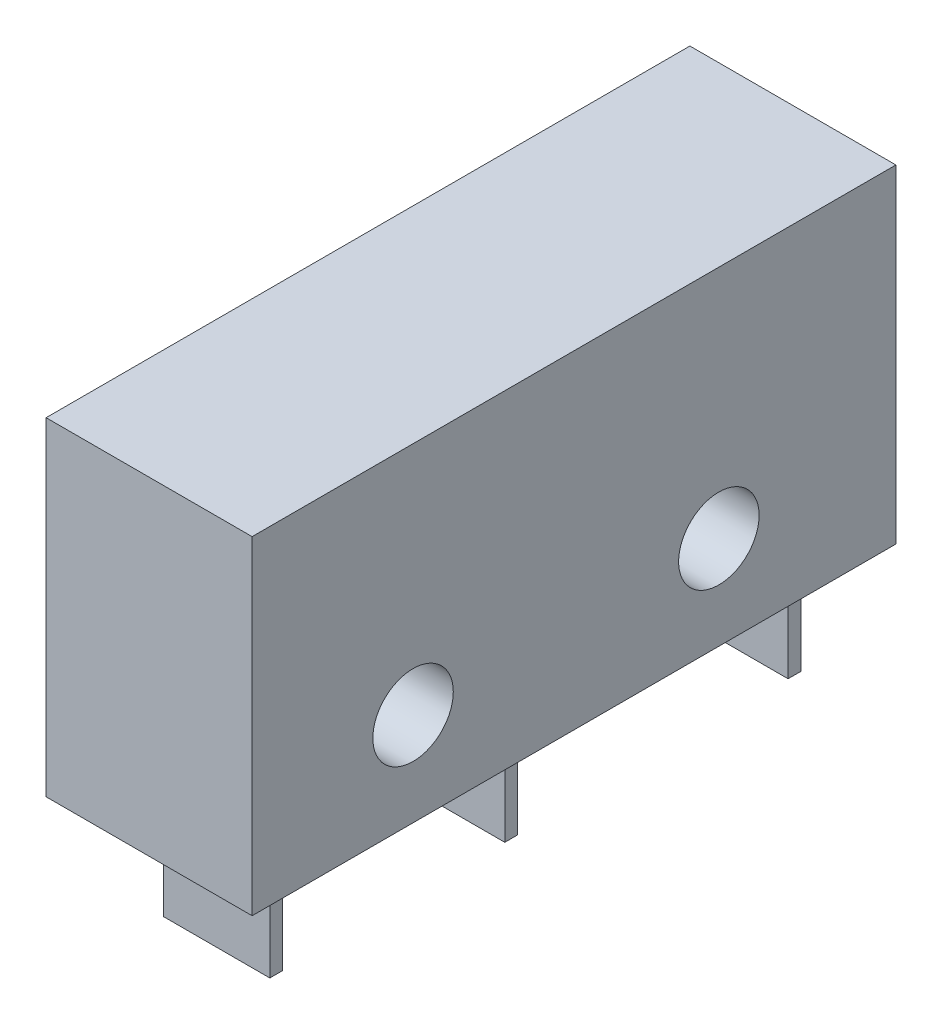
ISO-10303-21;
HEADER;
FILE_DESCRIPTION(('STEP AP214'),'2;1');
FILE_NAME('part.step','',(''),(''),'','','');
FILE_SCHEMA(('AUTOMOTIVE_DESIGN { 1 0 10303 214 1 1 1 1 }'));
ENDSEC;
DATA;
#1=APPLICATION_CONTEXT('core data for automotive mechanical design processes');
#2=APPLICATION_PROTOCOL_DEFINITION('international standard','automotive_design',2000,#1);
#3=PRODUCT_CONTEXT('',#1,'mechanical');
#4=PRODUCT('Part','Part','',(#3));
#5=PRODUCT_RELATED_PRODUCT_CATEGORY('part','',(#4));
#6=PRODUCT_DEFINITION_FORMATION('','',#4);
#7=PRODUCT_DEFINITION_CONTEXT('part definition',#1,'design');
#8=PRODUCT_DEFINITION('design','',#6,#7);
#9=PRODUCT_DEFINITION_SHAPE('','',#8);
#10=(LENGTH_UNIT() NAMED_UNIT(*) SI_UNIT(.MILLI.,.METRE.));
#11=(NAMED_UNIT(*) PLANE_ANGLE_UNIT() SI_UNIT($,.RADIAN.));
#12=(NAMED_UNIT(*) SI_UNIT($,.STERADIAN.) SOLID_ANGLE_UNIT());
#13=UNCERTAINTY_MEASURE_WITH_UNIT(LENGTH_MEASURE(1.E-05),#10,'distance_accuracy_value','');
#14=(GEOMETRIC_REPRESENTATION_CONTEXT(3) GLOBAL_UNCERTAINTY_ASSIGNED_CONTEXT((#13)) GLOBAL_UNIT_ASSIGNED_CONTEXT((#10,
#11,#12)) REPRESENTATION_CONTEXT('',''));
#15=CARTESIAN_POINT('',(0.,0.,0.));
#16=DIRECTION('',(0.,0.,1.));
#17=DIRECTION('',(1.,0.,0.));
#18=AXIS2_PLACEMENT_3D('',#15,#16,#17);
#19=CARTESIAN_POINT('',(3.2,-5.1,10.));
#20=DIRECTION('',(0.,1.,0.));
#21=DIRECTION('',(0.,0.,1.));
#22=AXIS2_PLACEMENT_3D('',#19,#20,#21);
#23=PLANE('',#22);
#24=DIRECTION('',(0.,0.,1.));
#25=VECTOR('',#24,1.);
#26=CARTESIAN_POINT('',(1.65,-5.1,0.199999999999999));
#27=LINE('',#26,#25);
#28=CARTESIAN_POINT('',(1.65,-5.1,0.199999999999999));
#29=VERTEX_POINT('',#28);
#30=CARTESIAN_POINT('',(1.65,-5.1,0.6));
#31=VERTEX_POINT('',#30);
#32=EDGE_CURVE('E207',#29,#31,#27,.T.);
#33=ORIENTED_EDGE('',*,*,#32,.F.);
#34=DIRECTION('',(1.,0.,0.));
#35=VECTOR('',#34,1.);
#36=CARTESIAN_POINT('',(-1.65,-5.1,0.199999999999999));
#37=LINE('',#36,#35);
#38=CARTESIAN_POINT('',(-1.65,-5.1,0.199999999999999));
#39=VERTEX_POINT('',#38);
#40=EDGE_CURVE('E197',#39,#29,#37,.T.);
#41=ORIENTED_EDGE('',*,*,#40,.F.);
#42=DIRECTION('',(0.,0.,-1.));
#43=VECTOR('',#42,1.);
#44=CARTESIAN_POINT('',(-1.65,-5.1,0.199999999999999));
#45=LINE('',#44,#43);
#46=CARTESIAN_POINT('',(-1.65,-5.1,0.6));
#47=VERTEX_POINT('',#46);
#48=EDGE_CURVE('E200',#47,#39,#45,.T.);
#49=ORIENTED_EDGE('',*,*,#48,.F.);
#50=DIRECTION('',(-1.,0.,0.));
#51=VECTOR('',#50,1.);
#52=CARTESIAN_POINT('',(-1.65,-5.1,0.599999999999999));
#53=LINE('',#52,#51);
#54=EDGE_CURVE('E204',#31,#47,#53,.T.);
#55=ORIENTED_EDGE('',*,*,#54,.F.);
#56=EDGE_LOOP('',(#33,#41,#49,#55));
#57=FACE_BOUND('',#56,.T.);
#58=DIRECTION('',(0.,0.,-1.));
#59=VECTOR('',#58,1.);
#60=CARTESIAN_POINT('',(-3.2,-5.1,10.));
#61=LINE('',#60,#59);
#62=CARTESIAN_POINT('',(-3.2,-5.1,10.));
#63=VERTEX_POINT('',#62);
#64=CARTESIAN_POINT('',(-3.2,-5.1,-10.));
#65=VERTEX_POINT('',#64);
#66=EDGE_CURVE('E267',#63,#65,#61,.T.);
#67=ORIENTED_EDGE('',*,*,#66,.T.);
#68=DIRECTION('',(-1.,0.,0.));
#69=VECTOR('',#68,1.);
#70=CARTESIAN_POINT('',(3.2,-5.1,-10.));
#71=LINE('',#70,#69);
#72=CARTESIAN_POINT('',(3.2,-5.1,-10.));
#73=VERTEX_POINT('',#72);
#74=EDGE_CURVE('E273',#73,#65,#71,.T.);
#75=ORIENTED_EDGE('',*,*,#74,.F.);
#76=DIRECTION('',(0.,0.,-1.));
#77=VECTOR('',#76,1.);
#78=CARTESIAN_POINT('',(3.2,-5.1,10.));
#79=LINE('',#78,#77);
#80=CARTESIAN_POINT('',(3.2,-5.1,10.));
#81=VERTEX_POINT('',#80);
#82=EDGE_CURVE('E271',#81,#73,#79,.T.);
#83=ORIENTED_EDGE('',*,*,#82,.F.);
#84=DIRECTION('',(-1.,0.,0.));
#85=VECTOR('',#84,1.);
#86=CARTESIAN_POINT('',(3.2,-5.1,10.));
#87=LINE('',#86,#85);
#88=EDGE_CURVE('E283',#81,#63,#87,.T.);
#89=ORIENTED_EDGE('',*,*,#88,.T.);
#90=EDGE_LOOP('',(#67,#75,#83,#89));
#91=FACE_BOUND('',#90,.T.);
#92=DIRECTION('',(0.,0.,1.));
#93=VECTOR('',#92,1.);
#94=CARTESIAN_POINT('',(1.65,-5.1,-8.6));
#95=LINE('',#94,#93);
#96=CARTESIAN_POINT('',(1.65,-5.1,-8.6));
#97=VERTEX_POINT('',#96);
#98=CARTESIAN_POINT('',(1.65,-5.1,-8.2));
#99=VERTEX_POINT('',#98);
#100=EDGE_CURVE('E210',#97,#99,#95,.T.);
#101=ORIENTED_EDGE('',*,*,#100,.F.);
#102=DIRECTION('',(1.,0.,0.));
#103=VECTOR('',#102,1.);
#104=CARTESIAN_POINT('',(-1.65,-5.1,-8.6));
#105=LINE('',#104,#103);
#106=CARTESIAN_POINT('',(-1.65,-5.1,-8.6));
#107=VERTEX_POINT('',#106);
#108=EDGE_CURVE('E222',#107,#97,#105,.T.);
#109=ORIENTED_EDGE('',*,*,#108,.F.);
#110=DIRECTION('',(0.,0.,-1.));
#111=VECTOR('',#110,1.);
#112=CARTESIAN_POINT('',(-1.65,-5.1,-8.6));
#113=LINE('',#112,#111);
#114=CARTESIAN_POINT('',(-1.65,-5.1,-8.2));
#115=VERTEX_POINT('',#114);
#116=EDGE_CURVE('E234',#115,#107,#113,.T.);
#117=ORIENTED_EDGE('',*,*,#116,.F.);
#118=DIRECTION('',(-1.,0.,0.));
#119=VECTOR('',#118,1.);
#120=CARTESIAN_POINT('',(-1.65,-5.1,-8.2));
#121=LINE('',#120,#119);
#122=EDGE_CURVE('E231',#99,#115,#121,.T.);
#123=ORIENTED_EDGE('',*,*,#122,.F.);
#124=EDGE_LOOP('',(#101,#109,#117,#123));
#125=FACE_BOUND('',#124,.T.);
#126=DIRECTION('',(0.,0.,1.));
#127=VECTOR('',#126,1.);
#128=CARTESIAN_POINT('',(1.65,-5.1,7.5));
#129=LINE('',#128,#127);
#130=CARTESIAN_POINT('',(1.65,-5.1,7.5));
#131=VERTEX_POINT('',#130);
#132=CARTESIAN_POINT('',(1.65,-5.1,7.9));
#133=VERTEX_POINT('',#132);
#134=EDGE_CURVE('E150',#131,#133,#129,.T.);
#135=ORIENTED_EDGE('',*,*,#134,.F.);
#136=DIRECTION('',(1.,0.,0.));
#137=VECTOR('',#136,1.);
#138=CARTESIAN_POINT('',(-1.65,-5.1,7.5));
#139=LINE('',#138,#137);
#140=CARTESIAN_POINT('',(-1.65,-5.1,7.5));
#141=VERTEX_POINT('',#140);
#142=EDGE_CURVE('E152',#141,#131,#139,.T.);
#143=ORIENTED_EDGE('',*,*,#142,.F.);
#144=DIRECTION('',(0.,0.,-1.));
#145=VECTOR('',#144,1.);
#146=CARTESIAN_POINT('',(-1.65,-5.1,7.5));
#147=LINE('',#146,#145);
#148=CARTESIAN_POINT('',(-1.65,-5.1,7.9));
#149=VERTEX_POINT('',#148);
#150=EDGE_CURVE('E61',#149,#141,#147,.T.);
#151=ORIENTED_EDGE('',*,*,#150,.F.);
#152=DIRECTION('',(-1.,0.,0.));
#153=VECTOR('',#152,1.);
#154=CARTESIAN_POINT('',(-1.65,-5.1,7.9));
#155=LINE('',#154,#153);
#156=EDGE_CURVE('E56',#133,#149,#155,.T.);
#157=ORIENTED_EDGE('',*,*,#156,.F.);
#158=EDGE_LOOP('',(#135,#143,#151,#157));
#159=FACE_BOUND('',#158,.T.);
#160=ADVANCED_FACE('F41',(#57,#91,#125,#159),#23,.F.);
#161=CARTESIAN_POINT('',(3.2,-5.1,-10.));
#162=DIRECTION('',(0.,0.,1.));
#163=DIRECTION('',(1.,0.,0.));
#164=AXIS2_PLACEMENT_3D('',#161,#162,#163);
#165=PLANE('',#164);
#166=DIRECTION('',(0.,1.,0.));
#167=VECTOR('',#166,1.);
#168=CARTESIAN_POINT('',(-3.2,-5.1,-10.));
#169=LINE('',#168,#167);
#170=CARTESIAN_POINT('',(-3.2,5.1,-10.));
#171=VERTEX_POINT('',#170);
#172=EDGE_CURVE('E258',#65,#171,#169,.T.);
#173=ORIENTED_EDGE('',*,*,#172,.T.);
#174=DIRECTION('',(-1.,0.,0.));
#175=VECTOR('',#174,1.);
#176=CARTESIAN_POINT('',(3.2,5.1,-10.));
#177=LINE('',#176,#175);
#178=CARTESIAN_POINT('',(3.2,5.1,-10.));
#179=VERTEX_POINT('',#178);
#180=EDGE_CURVE('E11',#179,#171,#177,.T.);
#181=ORIENTED_EDGE('',*,*,#180,.F.);
#182=DIRECTION('',(0.,1.,0.));
#183=VECTOR('',#182,1.);
#184=CARTESIAN_POINT('',(3.2,-5.1,-10.));
#185=LINE('',#184,#183);
#186=EDGE_CURVE('E263',#73,#179,#185,.T.);
#187=ORIENTED_EDGE('',*,*,#186,.F.);
#188=ORIENTED_EDGE('',*,*,#74,.T.);
#189=EDGE_LOOP('',(#173,#181,#187,#188));
#190=FACE_BOUND('',#189,.T.);
#191=ADVANCED_FACE('F43',(#190),#165,.F.);
#192=CARTESIAN_POINT('',(3.2,5.1,10.));
#193=DIRECTION('',(0.,-1.,0.));
#194=DIRECTION('',(0.,0.,-1.));
#195=AXIS2_PLACEMENT_3D('',#192,#193,#194);
#196=PLANE('',#195);
#197=DIRECTION('',(0.,0.,1.));
#198=VECTOR('',#197,1.);
#199=CARTESIAN_POINT('',(-3.2,5.1,10.));
#200=LINE('',#199,#198);
#201=CARTESIAN_POINT('',(-3.2,5.1,10.));
#202=VERTEX_POINT('',#201);
#203=EDGE_CURVE('E276',#171,#202,#200,.T.);
#204=ORIENTED_EDGE('',*,*,#203,.T.);
#205=DIRECTION('',(-1.,0.,0.));
#206=VECTOR('',#205,1.);
#207=CARTESIAN_POINT('',(3.2,5.1,10.));
#208=LINE('',#207,#206);
#209=CARTESIAN_POINT('',(3.2,5.1,10.));
#210=VERTEX_POINT('',#209);
#211=EDGE_CURVE('E49',#210,#202,#208,.T.);
#212=ORIENTED_EDGE('',*,*,#211,.F.);
#213=DIRECTION('',(0.,0.,1.));
#214=VECTOR('',#213,1.);
#215=CARTESIAN_POINT('',(3.2,5.1,10.));
#216=LINE('',#215,#214);
#217=EDGE_CURVE('E266',#179,#210,#216,.T.);
#218=ORIENTED_EDGE('',*,*,#217,.F.);
#219=ORIENTED_EDGE('',*,*,#180,.T.);
#220=EDGE_LOOP('',(#204,#212,#218,#219));
#221=FACE_BOUND('',#220,.T.);
#222=ADVANCED_FACE('F306',(#221),#196,.F.);
#223=CARTESIAN_POINT('',(3.2,-5.1,10.));
#224=DIRECTION('',(0.,0.,-1.));
#225=DIRECTION('',(-1.,0.,0.));
#226=AXIS2_PLACEMENT_3D('',#223,#224,#225);
#227=PLANE('',#226);
#228=DIRECTION('',(0.,-1.,0.));
#229=VECTOR('',#228,1.);
#230=CARTESIAN_POINT('',(-3.2,-5.1,10.));
#231=LINE('',#230,#229);
#232=EDGE_CURVE('E278',#202,#63,#231,.T.);
#233=ORIENTED_EDGE('',*,*,#232,.T.);
#234=ORIENTED_EDGE('',*,*,#88,.F.);
#235=DIRECTION('',(0.,-1.,0.));
#236=VECTOR('',#235,1.);
#237=CARTESIAN_POINT('',(3.2,-5.1,10.));
#238=LINE('',#237,#236);
#239=EDGE_CURVE('E269',#210,#81,#238,.T.);
#240=ORIENTED_EDGE('',*,*,#239,.F.);
#241=ORIENTED_EDGE('',*,*,#211,.T.);
#242=EDGE_LOOP('',(#233,#234,#240,#241));
#243=FACE_BOUND('',#242,.T.);
#244=ADVANCED_FACE('F290',(#243),#227,.F.);
#245=CARTESIAN_POINT('',(3.2,0.,0.));
#246=DIRECTION('',(-1.,0.,0.));
#247=DIRECTION('',(0.,0.,1.));
#248=AXIS2_PLACEMENT_3D('',#245,#246,#247);
#249=PLANE('',#248);
#250=CARTESIAN_POINT('',(3.2,-2.2,5.));
#251=DIRECTION('',(1.,0.,0.));
#252=DIRECTION('',(0.,0.,-1.));
#253=AXIS2_PLACEMENT_3D('',#250,#251,#252);
#254=CIRCLE('',#253,1.25);
#255=CARTESIAN_POINT('',(3.2,-2.2,3.75));
#256=VERTEX_POINT('',#255);
#257=EDGE_CURVE('E251',#256,#256,#254,.T.);
#258=ORIENTED_EDGE('',*,*,#257,.F.);
#259=EDGE_LOOP('',(#258));
#260=FACE_BOUND('',#259,.T.);
#261=CARTESIAN_POINT('',(3.2,-2.2,-4.5));
#262=DIRECTION('',(1.,0.,0.));
#263=DIRECTION('',(0.,0.,-1.));
#264=AXIS2_PLACEMENT_3D('',#261,#262,#263);
#265=CIRCLE('',#264,1.25);
#266=CARTESIAN_POINT('',(3.2,-2.2,-5.75));
#267=VERTEX_POINT('',#266);
#268=EDGE_CURVE('E255',#267,#267,#265,.T.);
#269=ORIENTED_EDGE('',*,*,#268,.F.);
#270=EDGE_LOOP('',(#269));
#271=FACE_BOUND('',#270,.T.);
#272=ORIENTED_EDGE('',*,*,#186,.T.);
#273=ORIENTED_EDGE('',*,*,#217,.T.);
#274=ORIENTED_EDGE('',*,*,#239,.T.);
#275=ORIENTED_EDGE('',*,*,#82,.T.);
#276=EDGE_LOOP('',(#272,#273,#274,#275));
#277=FACE_BOUND('',#276,.T.);
#278=ADVANCED_FACE('F305',(#260,#271,#277),#249,.F.);
#279=CARTESIAN_POINT('',(-3.2,0.,0.));
#280=DIRECTION('',(-1.,0.,0.));
#281=DIRECTION('',(0.,0.,1.));
#282=AXIS2_PLACEMENT_3D('',#279,#280,#281);
#283=PLANE('',#282);
#284=CARTESIAN_POINT('',(-3.2,-2.2,5.));
#285=DIRECTION('',(1.,0.,0.));
#286=DIRECTION('',(0.,0.,-1.));
#287=AXIS2_PLACEMENT_3D('',#284,#285,#286);
#288=CIRCLE('',#287,1.25);
#289=CARTESIAN_POINT('',(-3.2,-2.2,3.75));
#290=VERTEX_POINT('',#289);
#291=EDGE_CURVE('E254',#290,#290,#288,.T.);
#292=ORIENTED_EDGE('',*,*,#291,.T.);
#293=EDGE_LOOP('',(#292));
#294=FACE_BOUND('',#293,.T.);
#295=CARTESIAN_POINT('',(-3.2,-2.2,-4.5));
#296=DIRECTION('',(1.,0.,0.));
#297=DIRECTION('',(0.,0.,-1.));
#298=AXIS2_PLACEMENT_3D('',#295,#296,#297);
#299=CIRCLE('',#298,1.25);
#300=CARTESIAN_POINT('',(-3.2,-2.2,-5.75));
#301=VERTEX_POINT('',#300);
#302=EDGE_CURVE('E250',#301,#301,#299,.T.);
#303=ORIENTED_EDGE('',*,*,#302,.T.);
#304=EDGE_LOOP('',(#303));
#305=FACE_BOUND('',#304,.T.);
#306=ORIENTED_EDGE('',*,*,#172,.F.);
#307=ORIENTED_EDGE('',*,*,#66,.F.);
#308=ORIENTED_EDGE('',*,*,#232,.F.);
#309=ORIENTED_EDGE('',*,*,#203,.F.);
#310=EDGE_LOOP('',(#306,#307,#308,#309));
#311=FACE_BOUND('',#310,.T.);
#312=ADVANCED_FACE('F296',(#294,#305,#311),#283,.T.);
#313=CARTESIAN_POINT('',(-3.2,-2.2,-4.5));
#314=DIRECTION('',(1.,0.,0.));
#315=DIRECTION('',(0.,0.,-1.));
#316=AXIS2_PLACEMENT_3D('',#313,#314,#315);
#317=CYLINDRICAL_SURFACE('',#316,1.25);
#318=ORIENTED_EDGE('',*,*,#302,.F.);
#319=EDGE_LOOP('',(#318));
#320=FACE_BOUND('',#319,.T.);
#321=ORIENTED_EDGE('',*,*,#268,.T.);
#322=EDGE_LOOP('',(#321));
#323=FACE_BOUND('',#322,.T.);
#324=ADVANCED_FACE('F323',(#320,#323),#317,.F.);
#325=CARTESIAN_POINT('',(-3.2,-2.2,5.));
#326=DIRECTION('',(1.,0.,0.));
#327=DIRECTION('',(0.,0.,-1.));
#328=AXIS2_PLACEMENT_3D('',#325,#326,#327);
#329=CYLINDRICAL_SURFACE('',#328,1.25);
#330=ORIENTED_EDGE('',*,*,#291,.F.);
#331=EDGE_LOOP('',(#330));
#332=FACE_BOUND('',#331,.T.);
#333=ORIENTED_EDGE('',*,*,#257,.T.);
#334=EDGE_LOOP('',(#333));
#335=FACE_BOUND('',#334,.T.);
#336=ADVANCED_FACE('F330',(#332,#335),#329,.F.);
#337=CARTESIAN_POINT('',(1.65,-8.6,-8.6));
#338=DIRECTION('',(-1.,0.,0.));
#339=DIRECTION('',(0.,0.,1.));
#340=AXIS2_PLACEMENT_3D('',#337,#338,#339);
#341=PLANE('',#340);
#342=ORIENTED_EDGE('',*,*,#100,.T.);
#343=DIRECTION('',(0.,1.,0.));
#344=VECTOR('',#343,1.);
#345=CARTESIAN_POINT('',(1.65,-8.6,-8.2));
#346=LINE('',#345,#344);
#347=CARTESIAN_POINT('',(1.65,-8.6,-8.2));
#348=VERTEX_POINT('',#347);
#349=EDGE_CURVE('E247',#348,#99,#346,.T.);
#350=ORIENTED_EDGE('',*,*,#349,.F.);
#351=DIRECTION('',(0.,0.,1.));
#352=VECTOR('',#351,1.);
#353=CARTESIAN_POINT('',(1.65,-8.6,-8.6));
#354=LINE('',#353,#352);
#355=CARTESIAN_POINT('',(1.65,-8.6,-8.6));
#356=VERTEX_POINT('',#355);
#357=EDGE_CURVE('E218',#356,#348,#354,.T.);
#358=ORIENTED_EDGE('',*,*,#357,.F.);
#359=DIRECTION('',(0.,1.,0.));
#360=VECTOR('',#359,1.);
#361=CARTESIAN_POINT('',(1.65,-8.6,-8.6));
#362=LINE('',#361,#360);
#363=EDGE_CURVE('E228',#356,#97,#362,.T.);
#364=ORIENTED_EDGE('',*,*,#363,.T.);
#365=EDGE_LOOP('',(#342,#350,#358,#364));
#366=FACE_BOUND('',#365,.T.);
#367=ADVANCED_FACE('F334',(#366),#341,.F.);
#368=CARTESIAN_POINT('',(-1.65,-8.6,-8.2));
#369=DIRECTION('',(0.,0.,-1.));
#370=DIRECTION('',(-1.,0.,0.));
#371=AXIS2_PLACEMENT_3D('',#368,#369,#370);
#372=PLANE('',#371);
#373=ORIENTED_EDGE('',*,*,#122,.T.);
#374=DIRECTION('',(0.,1.,0.));
#375=VECTOR('',#374,1.);
#376=CARTESIAN_POINT('',(-1.65,-8.6,-8.2));
#377=LINE('',#376,#375);
#378=CARTESIAN_POINT('',(-1.65,-8.6,-8.2));
#379=VERTEX_POINT('',#378);
#380=EDGE_CURVE('E244',#379,#115,#377,.T.);
#381=ORIENTED_EDGE('',*,*,#380,.F.);
#382=DIRECTION('',(-1.,0.,0.));
#383=VECTOR('',#382,1.);
#384=CARTESIAN_POINT('',(-1.65,-8.6,-8.2));
#385=LINE('',#384,#383);
#386=EDGE_CURVE('E221',#348,#379,#385,.T.);
#387=ORIENTED_EDGE('',*,*,#386,.F.);
#388=ORIENTED_EDGE('',*,*,#349,.T.);
#389=EDGE_LOOP('',(#373,#381,#387,#388));
#390=FACE_BOUND('',#389,.T.);
#391=ADVANCED_FACE('F338',(#390),#372,.F.);
#392=CARTESIAN_POINT('',(-1.65,-8.6,-8.6));
#393=DIRECTION('',(1.,0.,0.));
#394=DIRECTION('',(0.,0.,-1.));
#395=AXIS2_PLACEMENT_3D('',#392,#393,#394);
#396=PLANE('',#395);
#397=ORIENTED_EDGE('',*,*,#116,.T.);
#398=DIRECTION('',(0.,1.,0.));
#399=VECTOR('',#398,1.);
#400=CARTESIAN_POINT('',(-1.65,-8.6,-8.6));
#401=LINE('',#400,#399);
#402=CARTESIAN_POINT('',(-1.65,-8.6,-8.6));
#403=VERTEX_POINT('',#402);
#404=EDGE_CURVE('E241',#403,#107,#401,.T.);
#405=ORIENTED_EDGE('',*,*,#404,.F.);
#406=DIRECTION('',(0.,0.,-1.));
#407=VECTOR('',#406,1.);
#408=CARTESIAN_POINT('',(-1.65,-8.6,-8.6));
#409=LINE('',#408,#407);
#410=EDGE_CURVE('E224',#379,#403,#409,.T.);
#411=ORIENTED_EDGE('',*,*,#410,.F.);
#412=ORIENTED_EDGE('',*,*,#380,.T.);
#413=EDGE_LOOP('',(#397,#405,#411,#412));
#414=FACE_BOUND('',#413,.T.);
#415=ADVANCED_FACE('F342',(#414),#396,.F.);
#416=CARTESIAN_POINT('',(-1.65,-8.6,-8.6));
#417=DIRECTION('',(0.,0.,1.));
#418=DIRECTION('',(1.,0.,0.));
#419=AXIS2_PLACEMENT_3D('',#416,#417,#418);
#420=PLANE('',#419);
#421=ORIENTED_EDGE('',*,*,#108,.T.);
#422=ORIENTED_EDGE('',*,*,#363,.F.);
#423=DIRECTION('',(1.,0.,0.));
#424=VECTOR('',#423,1.);
#425=CARTESIAN_POINT('',(-1.65,-8.6,-8.6));
#426=LINE('',#425,#424);
#427=EDGE_CURVE('E226',#403,#356,#426,.T.);
#428=ORIENTED_EDGE('',*,*,#427,.F.);
#429=ORIENTED_EDGE('',*,*,#404,.T.);
#430=EDGE_LOOP('',(#421,#422,#428,#429));
#431=FACE_BOUND('',#430,.T.);
#432=ADVANCED_FACE('F346',(#431),#420,.F.);
#433=CARTESIAN_POINT('',(0.,-8.6,0.));
#434=DIRECTION('',(0.,1.,0.));
#435=DIRECTION('',(0.,0.,1.));
#436=AXIS2_PLACEMENT_3D('',#433,#434,#435);
#437=PLANE('',#436);
#438=ORIENTED_EDGE('',*,*,#357,.T.);
#439=ORIENTED_EDGE('',*,*,#386,.T.);
#440=ORIENTED_EDGE('',*,*,#410,.T.);
#441=ORIENTED_EDGE('',*,*,#427,.T.);
#442=EDGE_LOOP('',(#438,#439,#440,#441));
#443=FACE_BOUND('',#442,.T.);
#444=ADVANCED_FACE('F350',(#443),#437,.F.);
#445=CARTESIAN_POINT('',(1.65,-8.6,0.199999999999999));
#446=DIRECTION('',(-1.,0.,0.));
#447=DIRECTION('',(0.,0.,1.));
#448=AXIS2_PLACEMENT_3D('',#445,#446,#447);
#449=PLANE('',#448);
#450=ORIENTED_EDGE('',*,*,#32,.T.);
#451=DIRECTION('',(0.,1.,0.));
#452=VECTOR('',#451,1.);
#453=CARTESIAN_POINT('',(1.65,-8.6,0.599999999999999));
#454=LINE('',#453,#452);
#455=CARTESIAN_POINT('',(1.65,-8.6,0.599999999999999));
#456=VERTEX_POINT('',#455);
#457=EDGE_CURVE('E156',#456,#31,#454,.T.);
#458=ORIENTED_EDGE('',*,*,#457,.F.);
#459=DIRECTION('',(0.,0.,1.));
#460=VECTOR('',#459,1.);
#461=CARTESIAN_POINT('',(1.65,-8.6,0.199999999999999));
#462=LINE('',#461,#460);
#463=CARTESIAN_POINT('',(1.65,-8.6,0.199999999999999));
#464=VERTEX_POINT('',#463);
#465=EDGE_CURVE('E201',#464,#456,#462,.T.);
#466=ORIENTED_EDGE('',*,*,#465,.F.);
#467=DIRECTION('',(0.,1.,0.));
#468=VECTOR('',#467,1.);
#469=CARTESIAN_POINT('',(1.65,-8.6,0.199999999999999));
#470=LINE('',#469,#468);
#471=EDGE_CURVE('E193',#464,#29,#470,.T.);
#472=ORIENTED_EDGE('',*,*,#471,.T.);
#473=EDGE_LOOP('',(#450,#458,#466,#472));
#474=FACE_BOUND('',#473,.T.);
#475=ADVANCED_FACE('F354',(#474),#449,.F.);
#476=CARTESIAN_POINT('',(-1.65,-8.6,0.599999999999999));
#477=DIRECTION('',(0.,0.,-1.));
#478=DIRECTION('',(-1.,0.,0.));
#479=AXIS2_PLACEMENT_3D('',#476,#477,#478);
#480=PLANE('',#479);
#481=ORIENTED_EDGE('',*,*,#54,.T.);
#482=DIRECTION('',(0.,1.,0.));
#483=VECTOR('',#482,1.);
#484=CARTESIAN_POINT('',(-1.65,-8.6,0.599999999999999));
#485=LINE('',#484,#483);
#486=CARTESIAN_POINT('',(-1.65,-8.6,0.599999999999999));
#487=VERTEX_POINT('',#486);
#488=EDGE_CURVE('E187',#487,#47,#485,.T.);
#489=ORIENTED_EDGE('',*,*,#488,.F.);
#490=DIRECTION('',(-1.,0.,0.));
#491=VECTOR('',#490,1.);
#492=CARTESIAN_POINT('',(-1.65,-8.6,0.599999999999999));
#493=LINE('',#492,#491);
#494=EDGE_CURVE('E214',#456,#487,#493,.T.);
#495=ORIENTED_EDGE('',*,*,#494,.F.);
#496=ORIENTED_EDGE('',*,*,#457,.T.);
#497=EDGE_LOOP('',(#481,#489,#495,#496));
#498=FACE_BOUND('',#497,.T.);
#499=ADVANCED_FACE('F367',(#498),#480,.F.);
#500=CARTESIAN_POINT('',(-1.65,-8.6,0.199999999999999));
#501=DIRECTION('',(1.,0.,0.));
#502=DIRECTION('',(0.,0.,-1.));
#503=AXIS2_PLACEMENT_3D('',#500,#501,#502);
#504=PLANE('',#503);
#505=ORIENTED_EDGE('',*,*,#48,.T.);
#506=DIRECTION('',(0.,1.,0.));
#507=VECTOR('',#506,1.);
#508=CARTESIAN_POINT('',(-1.65,-8.6,0.199999999999999));
#509=LINE('',#508,#507);
#510=CARTESIAN_POINT('',(-1.65,-8.6,0.199999999999999));
#511=VERTEX_POINT('',#510);
#512=EDGE_CURVE('E190',#511,#39,#509,.T.);
#513=ORIENTED_EDGE('',*,*,#512,.F.);
#514=DIRECTION('',(0.,0.,-1.));
#515=VECTOR('',#514,1.);
#516=CARTESIAN_POINT('',(-1.65,-8.6,0.199999999999999));
#517=LINE('',#516,#515);
#518=EDGE_CURVE('E212',#487,#511,#517,.T.);
#519=ORIENTED_EDGE('',*,*,#518,.F.);
#520=ORIENTED_EDGE('',*,*,#488,.T.);
#521=EDGE_LOOP('',(#505,#513,#519,#520));
#522=FACE_BOUND('',#521,.T.);
#523=ADVANCED_FACE('F363',(#522),#504,.F.);
#524=CARTESIAN_POINT('',(-1.65,-8.6,0.199999999999999));
#525=DIRECTION('',(0.,0.,1.));
#526=DIRECTION('',(1.,0.,0.));
#527=AXIS2_PLACEMENT_3D('',#524,#525,#526);
#528=PLANE('',#527);
#529=ORIENTED_EDGE('',*,*,#40,.T.);
#530=ORIENTED_EDGE('',*,*,#471,.F.);
#531=DIRECTION('',(1.,0.,0.));
#532=VECTOR('',#531,1.);
#533=CARTESIAN_POINT('',(-1.65,-8.6,0.199999999999999));
#534=LINE('',#533,#532);
#535=EDGE_CURVE('E196',#511,#464,#534,.T.);
#536=ORIENTED_EDGE('',*,*,#535,.F.);
#537=ORIENTED_EDGE('',*,*,#512,.T.);
#538=EDGE_LOOP('',(#529,#530,#536,#537));
#539=FACE_BOUND('',#538,.T.);
#540=ADVANCED_FACE('F359',(#539),#528,.F.);
#541=CARTESIAN_POINT('',(0.,-8.6,0.));
#542=DIRECTION('',(0.,1.,0.));
#543=DIRECTION('',(0.,0.,1.));
#544=AXIS2_PLACEMENT_3D('',#541,#542,#543);
#545=PLANE('',#544);
#546=ORIENTED_EDGE('',*,*,#465,.T.);
#547=ORIENTED_EDGE('',*,*,#494,.T.);
#548=ORIENTED_EDGE('',*,*,#518,.T.);
#549=ORIENTED_EDGE('',*,*,#535,.T.);
#550=EDGE_LOOP('',(#546,#547,#548,#549));
#551=FACE_BOUND('',#550,.T.);
#552=ADVANCED_FACE('F356',(#551),#545,.F.);
#553=CARTESIAN_POINT('',(1.65,-8.6,7.5));
#554=DIRECTION('',(-1.,0.,0.));
#555=DIRECTION('',(0.,0.,1.));
#556=AXIS2_PLACEMENT_3D('',#553,#554,#555);
#557=PLANE('',#556);
#558=ORIENTED_EDGE('',*,*,#134,.T.);
#559=DIRECTION('',(0.,1.,0.));
#560=VECTOR('',#559,1.);
#561=CARTESIAN_POINT('',(1.65,-8.6,7.9));
#562=LINE('',#561,#560);
#563=CARTESIAN_POINT('',(1.65,-8.6,7.9));
#564=VERTEX_POINT('',#563);
#565=EDGE_CURVE('E571',#564,#133,#562,.T.);
#566=ORIENTED_EDGE('',*,*,#565,.F.);
#567=DIRECTION('',(0.,0.,1.));
#568=VECTOR('',#567,1.);
#569=CARTESIAN_POINT('',(1.65,-8.6,7.5));
#570=LINE('',#569,#568);
#571=CARTESIAN_POINT('',(1.65,-8.6,7.5));
#572=VERTEX_POINT('',#571);
#573=EDGE_CURVE('E167',#572,#564,#570,.T.);
#574=ORIENTED_EDGE('',*,*,#573,.F.);
#575=DIRECTION('',(0.,1.,0.));
#576=VECTOR('',#575,1.);
#577=CARTESIAN_POINT('',(1.65,-8.6,7.5));
#578=LINE('',#577,#576);
#579=EDGE_CURVE('E163',#572,#131,#578,.T.);
#580=ORIENTED_EDGE('',*,*,#579,.T.);
#581=EDGE_LOOP('',(#558,#566,#574,#580));
#582=FACE_BOUND('',#581,.T.);
#583=ADVANCED_FACE('F169',(#582),#557,.F.);
#584=CARTESIAN_POINT('',(-1.65,-8.6,7.9));
#585=DIRECTION('',(0.,0.,-1.));
#586=DIRECTION('',(-1.,0.,0.));
#587=AXIS2_PLACEMENT_3D('',#584,#585,#586);
#588=PLANE('',#587);
#589=ORIENTED_EDGE('',*,*,#156,.T.);
#590=DIRECTION('',(0.,1.,0.));
#591=VECTOR('',#590,1.);
#592=CARTESIAN_POINT('',(-1.65,-8.6,7.9));
#593=LINE('',#592,#591);
#594=CARTESIAN_POINT('',(-1.65,-8.6,7.9));
#595=VERTEX_POINT('',#594);
#596=EDGE_CURVE('E175',#595,#149,#593,.T.);
#597=ORIENTED_EDGE('',*,*,#596,.F.);
#598=DIRECTION('',(-1.,0.,0.));
#599=VECTOR('',#598,1.);
#600=CARTESIAN_POINT('',(-1.65,-8.6,7.9));
#601=LINE('',#600,#599);
#602=EDGE_CURVE('E182',#564,#595,#601,.T.);
#603=ORIENTED_EDGE('',*,*,#602,.F.);
#604=ORIENTED_EDGE('',*,*,#565,.T.);
#605=EDGE_LOOP('',(#589,#597,#603,#604));
#606=FACE_BOUND('',#605,.T.);
#607=ADVANCED_FACE('F384',(#606),#588,.F.);
#608=CARTESIAN_POINT('',(-1.65,-8.6,7.5));
#609=DIRECTION('',(1.,0.,0.));
#610=DIRECTION('',(0.,0.,-1.));
#611=AXIS2_PLACEMENT_3D('',#608,#609,#610);
#612=PLANE('',#611);
#613=ORIENTED_EDGE('',*,*,#150,.T.);
#614=DIRECTION('',(0.,1.,0.));
#615=VECTOR('',#614,1.);
#616=CARTESIAN_POINT('',(-1.65,-8.6,7.5));
#617=LINE('',#616,#615);
#618=CARTESIAN_POINT('',(-1.65,-8.6,7.5));
#619=VERTEX_POINT('',#618);
#620=EDGE_CURVE('E166',#619,#141,#617,.T.);
#621=ORIENTED_EDGE('',*,*,#620,.F.);
#622=DIRECTION('',(0.,0.,-1.));
#623=VECTOR('',#622,1.);
#624=CARTESIAN_POINT('',(-1.65,-8.6,7.5));
#625=LINE('',#624,#623);
#626=EDGE_CURVE('E173',#595,#619,#625,.T.);
#627=ORIENTED_EDGE('',*,*,#626,.F.);
#628=ORIENTED_EDGE('',*,*,#596,.T.);
#629=EDGE_LOOP('',(#613,#621,#627,#628));
#630=FACE_BOUND('',#629,.T.);
#631=ADVANCED_FACE('F381',(#630),#612,.F.);
#632=CARTESIAN_POINT('',(-1.65,-8.6,7.5));
#633=DIRECTION('',(0.,0.,1.));
#634=DIRECTION('',(1.,0.,0.));
#635=AXIS2_PLACEMENT_3D('',#632,#633,#634);
#636=PLANE('',#635);
#637=ORIENTED_EDGE('',*,*,#142,.T.);
#638=ORIENTED_EDGE('',*,*,#579,.F.);
#639=DIRECTION('',(1.,0.,0.));
#640=VECTOR('',#639,1.);
#641=CARTESIAN_POINT('',(-1.65,-8.6,7.5));
#642=LINE('',#641,#640);
#643=EDGE_CURVE('E171',#619,#572,#642,.T.);
#644=ORIENTED_EDGE('',*,*,#643,.F.);
#645=ORIENTED_EDGE('',*,*,#620,.T.);
#646=EDGE_LOOP('',(#637,#638,#644,#645));
#647=FACE_BOUND('',#646,.T.);
#648=ADVANCED_FACE('F161',(#647),#636,.F.);
#649=CARTESIAN_POINT('',(0.,-8.6,0.));
#650=DIRECTION('',(0.,1.,0.));
#651=DIRECTION('',(0.,0.,1.));
#652=AXIS2_PLACEMENT_3D('',#649,#650,#651);
#653=PLANE('',#652);
#654=ORIENTED_EDGE('',*,*,#573,.T.);
#655=ORIENTED_EDGE('',*,*,#602,.T.);
#656=ORIENTED_EDGE('',*,*,#626,.T.);
#657=ORIENTED_EDGE('',*,*,#643,.T.);
#658=EDGE_LOOP('',(#654,#655,#656,#657));
#659=FACE_BOUND('',#658,.T.);
#660=ADVANCED_FACE('F375',(#659),#653,.F.);
#661=CLOSED_SHELL('',(#160,#191,#222,#244,#278,#312,#324,#336,#367,#391,#415,#432,#444,#475,
#499,#523,#540,#552,#583,#607,#631,#648,#660));
#662=MANIFOLD_SOLID_BREP('B2',#661);
#663=ADVANCED_BREP_SHAPE_REPRESENTATION('',(#18,#662),#14);
#664=SHAPE_DEFINITION_REPRESENTATION(#9,#663);
ENDSEC;
END-ISO-10303-21;
